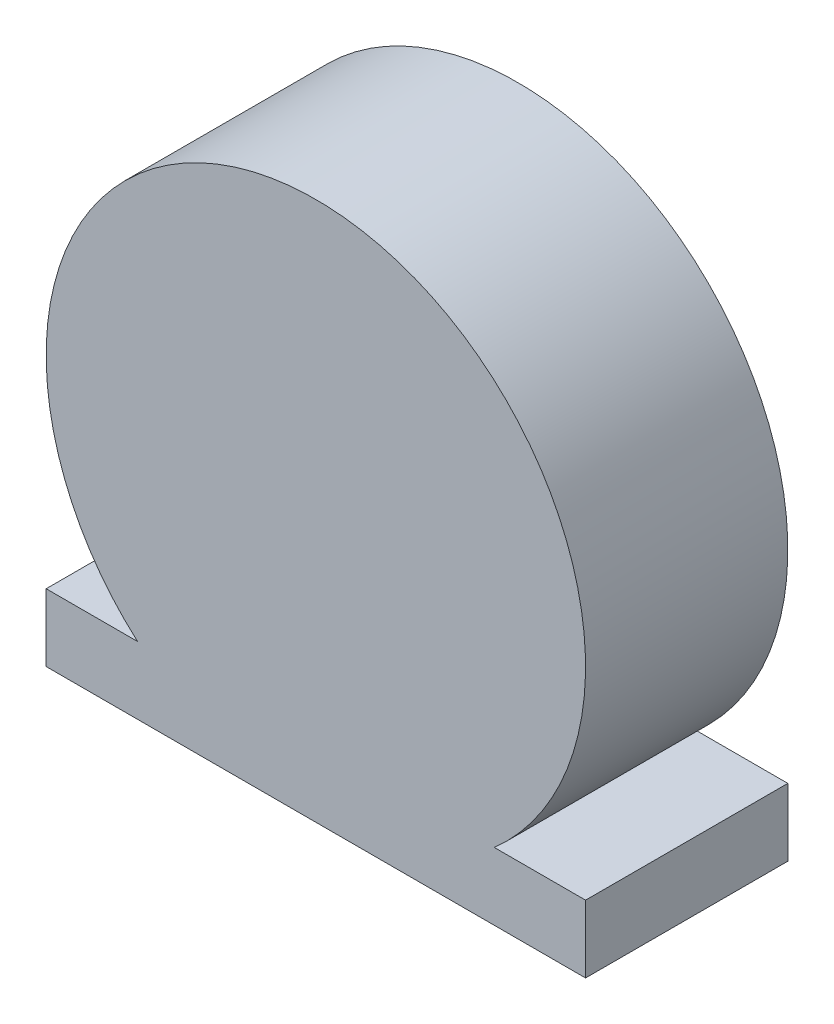
ISO-10303-21;
HEADER;
FILE_DESCRIPTION(('STEP AP214'),'2;1');
FILE_NAME('part.step','',(''),(''),'','','');
FILE_SCHEMA(('AUTOMOTIVE_DESIGN { 1 0 10303 214 1 1 1 1 }'));
ENDSEC;
DATA;
#1=APPLICATION_CONTEXT('core data for automotive mechanical design processes');
#2=APPLICATION_PROTOCOL_DEFINITION('international standard','automotive_design',2000,#1);
#3=PRODUCT_CONTEXT('',#1,'mechanical');
#4=PRODUCT('Part','Part','',(#3));
#5=PRODUCT_RELATED_PRODUCT_CATEGORY('part','',(#4));
#6=PRODUCT_DEFINITION_FORMATION('','',#4);
#7=PRODUCT_DEFINITION_CONTEXT('part definition',#1,'design');
#8=PRODUCT_DEFINITION('design','',#6,#7);
#9=PRODUCT_DEFINITION_SHAPE('','',#8);
#10=(LENGTH_UNIT() NAMED_UNIT(*) SI_UNIT(.MILLI.,.METRE.));
#11=(NAMED_UNIT(*) PLANE_ANGLE_UNIT() SI_UNIT($,.RADIAN.));
#12=(NAMED_UNIT(*) SI_UNIT($,.STERADIAN.) SOLID_ANGLE_UNIT());
#13=UNCERTAINTY_MEASURE_WITH_UNIT(LENGTH_MEASURE(1.E-05),#10,'distance_accuracy_value','');
#14=(GEOMETRIC_REPRESENTATION_CONTEXT(3) GLOBAL_UNCERTAINTY_ASSIGNED_CONTEXT((#13)) GLOBAL_UNIT_ASSIGNED_CONTEXT((#10,
#11,#12)) REPRESENTATION_CONTEXT('',''));
#15=CARTESIAN_POINT('',(0.,0.,0.));
#16=DIRECTION('',(0.,0.,1.));
#17=DIRECTION('',(1.,0.,0.));
#18=AXIS2_PLACEMENT_3D('',#15,#16,#17);
#19=CARTESIAN_POINT('',(0.,0.,15.));
#20=DIRECTION('',(0.,0.,-1.));
#21=DIRECTION('',(-1.,0.,0.));
#22=AXIS2_PLACEMENT_3D('',#19,#20,#21);
#23=CYLINDRICAL_SURFACE('',#22,20.);
#24=CARTESIAN_POINT('',(0.,0.,15.));
#25=DIRECTION('',(0.,0.,1.));
#26=DIRECTION('',(1.,0.,0.));
#27=AXIS2_PLACEMENT_3D('',#24,#25,#26);
#28=CIRCLE('',#27,20.);
#29=CARTESIAN_POINT('',(13.228756555323,-15.,15.));
#30=VERTEX_POINT('',#29);
#31=CARTESIAN_POINT('',(-13.228756555323,-15.,15.));
#32=VERTEX_POINT('',#31);
#33=EDGE_CURVE('E11',#30,#32,#28,.T.);
#34=ORIENTED_EDGE('',*,*,#33,.F.);
#35=DIRECTION('',(0.,0.,-1.));
#36=VECTOR('',#35,1.);
#37=CARTESIAN_POINT('',(13.228756555323,-15.,15.));
#38=LINE('',#37,#36);
#39=CARTESIAN_POINT('',(13.228756555323,-15.,0.));
#40=VERTEX_POINT('',#39);
#41=EDGE_CURVE('E132',#30,#40,#38,.T.);
#42=ORIENTED_EDGE('',*,*,#41,.T.);
#43=CARTESIAN_POINT('',(0.,0.,0.));
#44=DIRECTION('',(0.,0.,1.));
#45=DIRECTION('',(1.,0.,0.));
#46=AXIS2_PLACEMENT_3D('',#43,#44,#45);
#47=CIRCLE('',#46,20.);
#48=CARTESIAN_POINT('',(-13.228756555323,-15.,0.));
#49=VERTEX_POINT('',#48);
#50=EDGE_CURVE('E36',#40,#49,#47,.T.);
#51=ORIENTED_EDGE('',*,*,#50,.T.);
#52=DIRECTION('',(0.,0.,-1.));
#53=VECTOR('',#52,1.);
#54=CARTESIAN_POINT('',(-13.228756555323,-15.,15.));
#55=LINE('',#54,#53);
#56=EDGE_CURVE('E50',#49,#32,#55,.F.);
#57=ORIENTED_EDGE('',*,*,#56,.T.);
#58=EDGE_LOOP('',(#34,#42,#51,#57));
#59=FACE_BOUND('',#58,.T.);
#60=ADVANCED_FACE('F33',(#59),#23,.T.);
#61=CARTESIAN_POINT('',(0.,0.,15.));
#62=DIRECTION('',(0.,0.,1.));
#63=DIRECTION('',(1.,0.,0.));
#64=AXIS2_PLACEMENT_3D('',#61,#62,#63);
#65=PLANE('',#64);
#66=ORIENTED_EDGE('',*,*,#33,.T.);
#67=DIRECTION('',(1.,0.,0.));
#68=VECTOR('',#67,1.);
#69=CARTESIAN_POINT('',(-20.,-15.,15.));
#70=LINE('',#69,#68);
#71=CARTESIAN_POINT('',(-20.,-15.,15.));
#72=VERTEX_POINT('',#71);
#73=EDGE_CURVE('E85',#72,#32,#70,.T.);
#74=ORIENTED_EDGE('',*,*,#73,.F.);
#75=DIRECTION('',(0.,1.,0.));
#76=VECTOR('',#75,1.);
#77=CARTESIAN_POINT('',(-20.,-15.,15.));
#78=LINE('',#77,#76);
#79=CARTESIAN_POINT('',(-20.,-20.,15.));
#80=VERTEX_POINT('',#79);
#81=EDGE_CURVE('E98',#80,#72,#78,.T.);
#82=ORIENTED_EDGE('',*,*,#81,.F.);
#83=DIRECTION('',(-1.,0.,0.));
#84=VECTOR('',#83,1.);
#85=CARTESIAN_POINT('',(-20.,-20.,15.));
#86=LINE('',#85,#84);
#87=CARTESIAN_POINT('',(20.,-20.,15.));
#88=VERTEX_POINT('',#87);
#89=EDGE_CURVE('E93',#88,#80,#86,.T.);
#90=ORIENTED_EDGE('',*,*,#89,.F.);
#91=DIRECTION('',(0.,-1.,0.));
#92=VECTOR('',#91,1.);
#93=CARTESIAN_POINT('',(20.,-15.,15.));
#94=LINE('',#93,#92);
#95=CARTESIAN_POINT('',(20.,-15.,15.));
#96=VERTEX_POINT('',#95);
#97=EDGE_CURVE('E100',#96,#88,#94,.T.);
#98=ORIENTED_EDGE('',*,*,#97,.F.);
#99=EDGE_CURVE('E101',#30,#96,#70,.T.);
#100=ORIENTED_EDGE('',*,*,#99,.F.);
#101=EDGE_LOOP('',(#66,#74,#82,#90,#98,#100));
#102=FACE_BOUND('',#101,.T.);
#103=ADVANCED_FACE('F97',(#102),#65,.T.);
#104=CARTESIAN_POINT('',(0.,0.,0.));
#105=DIRECTION('',(0.,0.,1.));
#106=DIRECTION('',(1.,0.,0.));
#107=AXIS2_PLACEMENT_3D('',#104,#105,#106);
#108=PLANE('',#107);
#109=CARTESIAN_POINT('',(0.,0.,0.));
#110=DIRECTION('',(0.,0.,-1.));
#111=DIRECTION('',(-1.,0.,0.));
#112=AXIS2_PLACEMENT_3D('',#109,#110,#111);
#113=CIRCLE('',#112,15.875);
#114=CARTESIAN_POINT('',(-15.875,0.,0.));
#115=VERTEX_POINT('',#114);
#116=EDGE_CURVE('E112',#115,#115,#113,.T.);
#117=ORIENTED_EDGE('',*,*,#116,.F.);
#118=EDGE_LOOP('',(#117));
#119=FACE_BOUND('',#118,.T.);
#120=ORIENTED_EDGE('',*,*,#50,.F.);
#121=DIRECTION('',(1.,0.,0.));
#122=VECTOR('',#121,1.);
#123=CARTESIAN_POINT('',(-20.,-15.,0.));
#124=LINE('',#123,#122);
#125=CARTESIAN_POINT('',(20.,-15.,0.));
#126=VERTEX_POINT('',#125);
#127=EDGE_CURVE('E120',#40,#126,#124,.T.);
#128=ORIENTED_EDGE('',*,*,#127,.T.);
#129=DIRECTION('',(0.,-1.,0.));
#130=VECTOR('',#129,1.);
#131=CARTESIAN_POINT('',(20.,-15.,0.));
#132=LINE('',#131,#130);
#133=CARTESIAN_POINT('',(20.,-20.,0.));
#134=VERTEX_POINT('',#133);
#135=EDGE_CURVE('E109',#126,#134,#132,.T.);
#136=ORIENTED_EDGE('',*,*,#135,.T.);
#137=DIRECTION('',(-1.,0.,0.));
#138=VECTOR('',#137,1.);
#139=CARTESIAN_POINT('',(-20.,-20.,0.));
#140=LINE('',#139,#138);
#141=CARTESIAN_POINT('',(-20.,-20.,0.));
#142=VERTEX_POINT('',#141);
#143=EDGE_CURVE('E107',#134,#142,#140,.T.);
#144=ORIENTED_EDGE('',*,*,#143,.T.);
#145=DIRECTION('',(0.,1.,0.));
#146=VECTOR('',#145,1.);
#147=CARTESIAN_POINT('',(-20.,-15.,0.));
#148=LINE('',#147,#146);
#149=CARTESIAN_POINT('',(-20.,-15.,0.));
#150=VERTEX_POINT('',#149);
#151=EDGE_CURVE('E118',#142,#150,#148,.T.);
#152=ORIENTED_EDGE('',*,*,#151,.T.);
#153=EDGE_CURVE('E87',#150,#49,#124,.T.);
#154=ORIENTED_EDGE('',*,*,#153,.T.);
#155=EDGE_LOOP('',(#120,#128,#136,#144,#152,#154));
#156=FACE_BOUND('',#155,.T.);
#157=ADVANCED_FACE('F135',(#119,#156),#108,.F.);
#158=CARTESIAN_POINT('',(-20.,-20.,15.));
#159=DIRECTION('',(0.,-1.,0.));
#160=DIRECTION('',(1.,0.,0.));
#161=AXIS2_PLACEMENT_3D('',#158,#159,#160);
#162=PLANE('',#161);
#163=ORIENTED_EDGE('',*,*,#143,.F.);
#164=DIRECTION('',(0.,0.,-1.));
#165=VECTOR('',#164,1.);
#166=CARTESIAN_POINT('',(20.,-20.,15.));
#167=LINE('',#166,#165);
#168=EDGE_CURVE('E126',#88,#134,#167,.T.);
#169=ORIENTED_EDGE('',*,*,#168,.F.);
#170=ORIENTED_EDGE('',*,*,#89,.T.);
#171=DIRECTION('',(0.,0.,-1.));
#172=VECTOR('',#171,1.);
#173=CARTESIAN_POINT('',(-20.,-20.,15.));
#174=LINE('',#173,#172);
#175=EDGE_CURVE('E106',#80,#142,#174,.T.);
#176=ORIENTED_EDGE('',*,*,#175,.T.);
#177=EDGE_LOOP('',(#163,#169,#170,#176));
#178=FACE_BOUND('',#177,.T.);
#179=ADVANCED_FACE('F139',(#178),#162,.T.);
#180=CARTESIAN_POINT('',(-20.,-15.,15.));
#181=DIRECTION('',(0.,1.,0.));
#182=DIRECTION('',(-1.,0.,0.));
#183=AXIS2_PLACEMENT_3D('',#180,#181,#182);
#184=PLANE('',#183);
#185=ORIENTED_EDGE('',*,*,#41,.F.);
#186=ORIENTED_EDGE('',*,*,#99,.T.);
#187=DIRECTION('',(0.,0.,-1.));
#188=VECTOR('',#187,1.);
#189=CARTESIAN_POINT('',(20.,-15.,15.));
#190=LINE('',#189,#188);
#191=EDGE_CURVE('E92',#96,#126,#190,.T.);
#192=ORIENTED_EDGE('',*,*,#191,.T.);
#193=ORIENTED_EDGE('',*,*,#127,.F.);
#194=EDGE_LOOP('',(#185,#186,#192,#193));
#195=FACE_BOUND('',#194,.T.);
#196=ADVANCED_FACE('F145',(#195),#184,.T.);
#197=ORIENTED_EDGE('',*,*,#56,.F.);
#198=ORIENTED_EDGE('',*,*,#153,.F.);
#199=DIRECTION('',(0.,0.,-1.));
#200=VECTOR('',#199,1.);
#201=CARTESIAN_POINT('',(-20.,-15.,15.));
#202=LINE('',#201,#200);
#203=EDGE_CURVE('E82',#72,#150,#202,.T.);
#204=ORIENTED_EDGE('',*,*,#203,.F.);
#205=ORIENTED_EDGE('',*,*,#73,.T.);
#206=EDGE_LOOP('',(#197,#198,#204,#205));
#207=FACE_BOUND('',#206,.T.);
#208=ADVANCED_FACE('F84',(#207),#184,.T.);
#209=CARTESIAN_POINT('',(-20.,-15.,15.));
#210=DIRECTION('',(-1.,0.,0.));
#211=DIRECTION('',(0.,0.,1.));
#212=AXIS2_PLACEMENT_3D('',#209,#210,#211);
#213=PLANE('',#212);
#214=ORIENTED_EDGE('',*,*,#151,.F.);
#215=ORIENTED_EDGE('',*,*,#175,.F.);
#216=ORIENTED_EDGE('',*,*,#81,.T.);
#217=ORIENTED_EDGE('',*,*,#203,.T.);
#218=EDGE_LOOP('',(#214,#215,#216,#217));
#219=FACE_BOUND('',#218,.T.);
#220=ADVANCED_FACE('F104',(#219),#213,.T.);
#221=CARTESIAN_POINT('',(20.,-15.,15.));
#222=DIRECTION('',(1.,0.,0.));
#223=DIRECTION('',(0.,1.,0.));
#224=AXIS2_PLACEMENT_3D('',#221,#222,#223);
#225=PLANE('',#224);
#226=ORIENTED_EDGE('',*,*,#135,.F.);
#227=ORIENTED_EDGE('',*,*,#191,.F.);
#228=ORIENTED_EDGE('',*,*,#97,.T.);
#229=ORIENTED_EDGE('',*,*,#168,.T.);
#230=EDGE_LOOP('',(#226,#227,#228,#229));
#231=FACE_BOUND('',#230,.T.);
#232=ADVANCED_FACE('F143',(#231),#225,.T.);
#233=CARTESIAN_POINT('',(0.,0.,10.));
#234=DIRECTION('',(0.,0.,-1.));
#235=DIRECTION('',(-1.,0.,0.));
#236=AXIS2_PLACEMENT_3D('',#233,#234,#235);
#237=CYLINDRICAL_SURFACE('',#236,15.875);
#238=CARTESIAN_POINT('',(0.,0.,10.));
#239=DIRECTION('',(0.,0.,-1.));
#240=DIRECTION('',(-1.,0.,0.));
#241=AXIS2_PLACEMENT_3D('',#238,#239,#240);
#242=CIRCLE('',#241,15.875);
#243=CARTESIAN_POINT('',(-15.875,0.,10.));
#244=VERTEX_POINT('',#243);
#245=EDGE_CURVE('E121',#244,#244,#242,.T.);
#246=ORIENTED_EDGE('',*,*,#245,.F.);
#247=EDGE_LOOP('',(#246));
#248=FACE_BOUND('',#247,.T.);
#249=ORIENTED_EDGE('',*,*,#116,.T.);
#250=EDGE_LOOP('',(#249));
#251=FACE_BOUND('',#250,.T.);
#252=ADVANCED_FACE('F168',(#248,#251),#237,.F.);
#253=CARTESIAN_POINT('',(0.,0.,10.));
#254=DIRECTION('',(0.,0.,-1.));
#255=DIRECTION('',(-1.,0.,0.));
#256=AXIS2_PLACEMENT_3D('',#253,#254,#255);
#257=PLANE('',#256);
#258=ORIENTED_EDGE('',*,*,#245,.T.);
#259=EDGE_LOOP('',(#258));
#260=FACE_BOUND('',#259,.T.);
#261=ADVANCED_FACE('F172',(#260),#257,.T.);
#262=CLOSED_SHELL('',(#60,#103,#157,#179,#196,#208,#220,#232,#252,#261));
#263=MANIFOLD_SOLID_BREP('B2',#262);
#264=ADVANCED_BREP_SHAPE_REPRESENTATION('',(#18,#263),#14);
#265=SHAPE_DEFINITION_REPRESENTATION(#9,#264);
ENDSEC;
END-ISO-10303-21;
